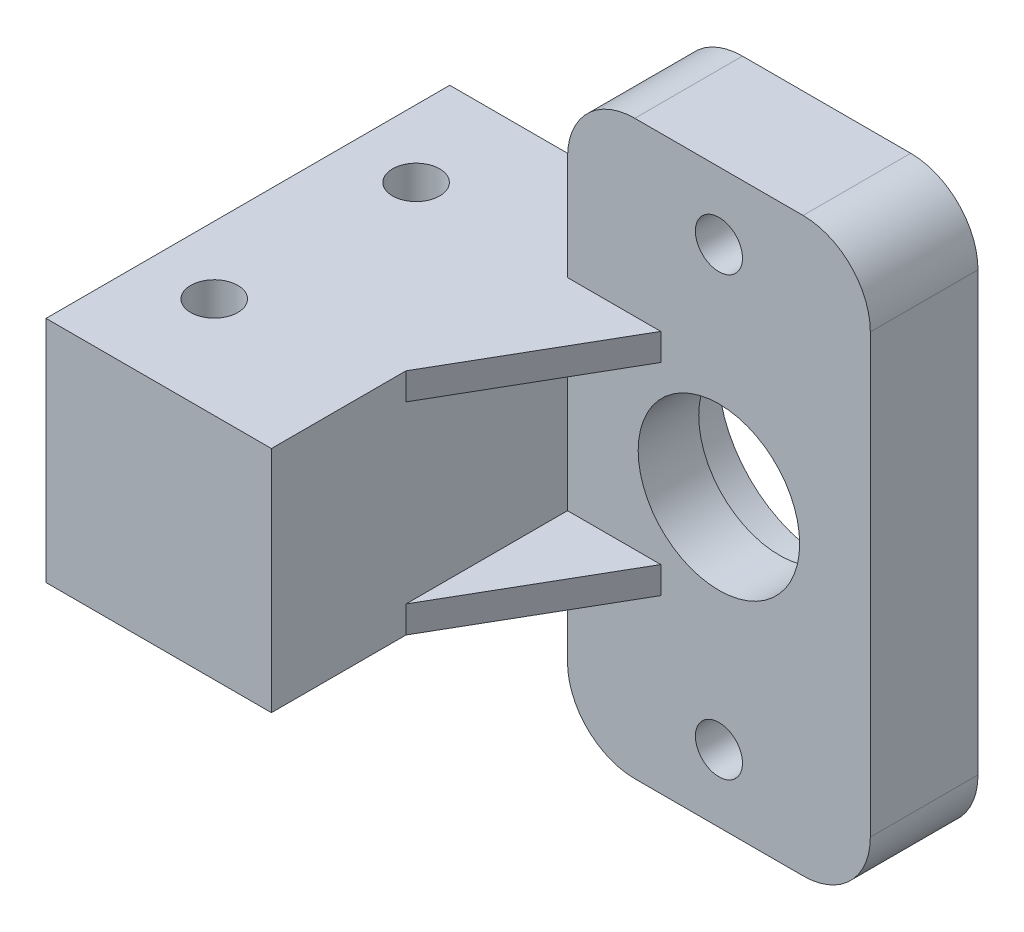
ISO-10303-21;
HEADER;
FILE_DESCRIPTION(('STEP AP214'),'2;1');
FILE_NAME('part.step','',(''),(''),'','','');
FILE_SCHEMA(('AUTOMOTIVE_DESIGN { 1 0 10303 214 1 1 1 1 }'));
ENDSEC;
DATA;
#1=APPLICATION_CONTEXT('core data for automotive mechanical design processes');
#2=APPLICATION_PROTOCOL_DEFINITION('international standard','automotive_design',2000,#1);
#3=PRODUCT_CONTEXT('',#1,'mechanical');
#4=PRODUCT('Part','Part','',(#3));
#5=PRODUCT_RELATED_PRODUCT_CATEGORY('part','',(#4));
#6=PRODUCT_DEFINITION_FORMATION('','',#4);
#7=PRODUCT_DEFINITION_CONTEXT('part definition',#1,'design');
#8=PRODUCT_DEFINITION('design','',#6,#7);
#9=PRODUCT_DEFINITION_SHAPE('','',#8);
#10=(LENGTH_UNIT() NAMED_UNIT(*) SI_UNIT(.MILLI.,.METRE.));
#11=(NAMED_UNIT(*) PLANE_ANGLE_UNIT() SI_UNIT($,.RADIAN.));
#12=(NAMED_UNIT(*) SI_UNIT($,.STERADIAN.) SOLID_ANGLE_UNIT());
#13=UNCERTAINTY_MEASURE_WITH_UNIT(LENGTH_MEASURE(1.E-05),#10,'distance_accuracy_value','');
#14=(GEOMETRIC_REPRESENTATION_CONTEXT(3) GLOBAL_UNCERTAINTY_ASSIGNED_CONTEXT((#13)) GLOBAL_UNIT_ASSIGNED_CONTEXT((#10,
#11,#12)) REPRESENTATION_CONTEXT('',''));
#15=CARTESIAN_POINT('',(0.,0.,0.));
#16=DIRECTION('',(0.,0.,1.));
#17=DIRECTION('',(1.,0.,0.));
#18=AXIS2_PLACEMENT_3D('',#15,#16,#17);
#19=CARTESIAN_POINT('',(-6.25000000000142,16.2500000000003,8.));
#20=DIRECTION('',(0.,0.,1.));
#21=DIRECTION('',(1.,0.,0.));
#22=AXIS2_PLACEMENT_3D('',#19,#20,#21);
#23=PLANE('',#22);
#24=CARTESIAN_POINT('',(0.,16.2500000000003,8.));
#25=DIRECTION('',(0.,0.,1.));
#26=DIRECTION('',(1.,0.,0.));
#27=AXIS2_PLACEMENT_3D('',#24,#25,#26);
#28=CIRCLE('',#27,1.74999999999992);
#29=CARTESIAN_POINT('',(1.74999999999992,16.2500000000003,8.));
#30=VERTEX_POINT('',#29);
#31=EDGE_CURVE('E296',#30,#30,#28,.T.);
#32=ORIENTED_EDGE('',*,*,#31,.F.);
#33=EDGE_LOOP('',(#32));
#34=FACE_BOUND('',#33,.T.);
#35=CARTESIAN_POINT('',(0.,-16.2499999999999,8.));
#36=DIRECTION('',(0.,0.,1.));
#37=DIRECTION('',(1.,0.,0.));
#38=AXIS2_PLACEMENT_3D('',#35,#36,#37);
#39=CIRCLE('',#38,1.74999999999992);
#40=CARTESIAN_POINT('',(1.74999999999992,-16.2499999999999,8.));
#41=VERTEX_POINT('',#40);
#42=EDGE_CURVE('E205',#41,#41,#39,.T.);
#43=ORIENTED_EDGE('',*,*,#42,.F.);
#44=EDGE_LOOP('',(#43));
#45=FACE_BOUND('',#44,.T.);
#46=CARTESIAN_POINT('',(0.,0.,8.));
#47=DIRECTION('',(0.,0.,1.));
#48=DIRECTION('',(1.,0.,0.));
#49=AXIS2_PLACEMENT_3D('',#46,#47,#48);
#50=CIRCLE('',#49,5.99999999999978);
#51=CARTESIAN_POINT('',(5.99999999999978,0.,8.));
#52=VERTEX_POINT('',#51);
#53=EDGE_CURVE('E299',#52,#52,#50,.T.);
#54=ORIENTED_EDGE('',*,*,#53,.F.);
#55=EDGE_LOOP('',(#54));
#56=FACE_BOUND('',#55,.T.);
#57=DIRECTION('',(0.,1.,0.));
#58=VECTOR('',#57,1.);
#59=CARTESIAN_POINT('',(-4.3217967697244,6.50000000000017,8.));
#60=LINE('',#59,#58);
#61=CARTESIAN_POINT('',(-4.3217967697244,6.50000000000017,8.));
#62=VERTEX_POINT('',#61);
#63=CARTESIAN_POINT('',(-4.3217967697244,8.50000000000017,8.));
#64=VERTEX_POINT('',#63);
#65=EDGE_CURVE('E174',#62,#64,#60,.T.);
#66=ORIENTED_EDGE('',*,*,#65,.F.);
#67=DIRECTION('',(-1.,0.,0.));
#68=VECTOR('',#67,1.);
#69=CARTESIAN_POINT('',(-11.2500000000013,6.50000000000017,8.));
#70=LINE('',#69,#68);
#71=CARTESIAN_POINT('',(-11.2500000000013,6.50000000000017,8.));
#72=VERTEX_POINT('',#71);
#73=EDGE_CURVE('E163',#62,#72,#70,.T.);
#74=ORIENTED_EDGE('',*,*,#73,.T.);
#75=DIRECTION('',(0.,-1.,0.));
#76=VECTOR('',#75,1.);
#77=CARTESIAN_POINT('',(-11.2500000000013,16.2500000000003,8.));
#78=LINE('',#77,#76);
#79=CARTESIAN_POINT('',(-11.2500000000013,-6.49999999999973,8.));
#80=VERTEX_POINT('',#79);
#81=EDGE_CURVE('E171',#72,#80,#78,.T.);
#82=ORIENTED_EDGE('',*,*,#81,.T.);
#83=DIRECTION('',(1.,0.,0.));
#84=VECTOR('',#83,1.);
#85=CARTESIAN_POINT('',(-11.2500000000013,-6.49999999999973,8.));
#86=LINE('',#85,#84);
#87=CARTESIAN_POINT('',(-4.3217967697244,-6.49999999999973,8.));
#88=VERTEX_POINT('',#87);
#89=EDGE_CURVE('E52',#80,#88,#86,.T.);
#90=ORIENTED_EDGE('',*,*,#89,.T.);
#91=DIRECTION('',(0.,-1.,0.));
#92=VECTOR('',#91,1.);
#93=CARTESIAN_POINT('',(-4.3217967697244,-6.49999999999973,8.));
#94=LINE('',#93,#92);
#95=CARTESIAN_POINT('',(-4.3217967697244,-8.49999999999973,8.));
#96=VERTEX_POINT('',#95);
#97=EDGE_CURVE('E56',#88,#96,#94,.T.);
#98=ORIENTED_EDGE('',*,*,#97,.T.);
#99=DIRECTION('',(1.,0.,0.));
#100=VECTOR('',#99,1.);
#101=CARTESIAN_POINT('',(-11.2500000000013,-8.49999999999973,8.));
#102=LINE('',#101,#100);
#103=CARTESIAN_POINT('',(-11.2500000000013,-8.49999999999973,8.));
#104=VERTEX_POINT('',#103);
#105=EDGE_CURVE('E387',#104,#96,#102,.T.);
#106=ORIENTED_EDGE('',*,*,#105,.F.);
#107=CARTESIAN_POINT('',(-11.2500000000013,-16.2500000000008,8.));
#108=VERTEX_POINT('',#107);
#109=EDGE_CURVE('E181',#104,#108,#78,.T.);
#110=ORIENTED_EDGE('',*,*,#109,.T.);
#111=CARTESIAN_POINT('',(-6.25000000000142,-16.2500000000008,8.));
#112=DIRECTION('',(0.,0.,1.));
#113=DIRECTION('',(1.,0.,0.));
#114=AXIS2_PLACEMENT_3D('',#111,#112,#113);
#115=CIRCLE('',#114,4.99999999999989);
#116=CARTESIAN_POINT('',(-6.25000000000142,-21.2500000000007,8.));
#117=VERTEX_POINT('',#116);
#118=EDGE_CURVE('E184',#108,#117,#115,.T.);
#119=ORIENTED_EDGE('',*,*,#118,.T.);
#120=DIRECTION('',(1.,0.,0.));
#121=VECTOR('',#120,1.);
#122=CARTESIAN_POINT('',(-6.25000000000142,-21.2500000000007,8.));
#123=LINE('',#122,#121);
#124=CARTESIAN_POINT('',(6.24999999999876,-21.2500000000007,8.));
#125=VERTEX_POINT('',#124);
#126=EDGE_CURVE('E190',#117,#125,#123,.T.);
#127=ORIENTED_EDGE('',*,*,#126,.T.);
#128=CARTESIAN_POINT('',(6.24999999999876,-16.2500000000008,8.));
#129=DIRECTION('',(0.,0.,1.));
#130=DIRECTION('',(1.,0.,0.));
#131=AXIS2_PLACEMENT_3D('',#128,#129,#130);
#132=CIRCLE('',#131,4.99999999999989);
#133=CARTESIAN_POINT('',(11.2499999999986,-16.2500000000008,8.));
#134=VERTEX_POINT('',#133);
#135=EDGE_CURVE('E192',#125,#134,#132,.T.);
#136=ORIENTED_EDGE('',*,*,#135,.T.);
#137=DIRECTION('',(0.,1.,0.));
#138=VECTOR('',#137,1.);
#139=CARTESIAN_POINT('',(11.2499999999986,16.2499999999994,8.));
#140=LINE('',#139,#138);
#141=CARTESIAN_POINT('',(11.2499999999986,16.2499999999994,8.));
#142=VERTEX_POINT('',#141);
#143=EDGE_CURVE('E194',#134,#142,#140,.T.);
#144=ORIENTED_EDGE('',*,*,#143,.T.);
#145=CARTESIAN_POINT('',(6.24999999999876,16.2500000000003,8.));
#146=DIRECTION('',(0.,0.,1.));
#147=DIRECTION('',(1.,0.,0.));
#148=AXIS2_PLACEMENT_3D('',#145,#146,#147);
#149=CIRCLE('',#148,4.99999999999989);
#150=CARTESIAN_POINT('',(6.25000000000009,21.2500000000002,8.));
#151=VERTEX_POINT('',#150);
#152=EDGE_CURVE('E196',#142,#151,#149,.T.);
#153=ORIENTED_EDGE('',*,*,#152,.T.);
#154=DIRECTION('',(-1.,0.,0.));
#155=VECTOR('',#154,1.);
#156=CARTESIAN_POINT('',(-6.25000000000009,21.2500000000002,8.));
#157=LINE('',#156,#155);
#158=CARTESIAN_POINT('',(-6.25000000000009,21.2500000000002,8.));
#159=VERTEX_POINT('',#158);
#160=EDGE_CURVE('E198',#151,#159,#157,.T.);
#161=ORIENTED_EDGE('',*,*,#160,.T.);
#162=CARTESIAN_POINT('',(-6.25000000000142,16.2500000000003,8.));
#163=DIRECTION('',(0.,0.,1.));
#164=DIRECTION('',(1.,0.,0.));
#165=AXIS2_PLACEMENT_3D('',#162,#163,#164);
#166=CIRCLE('',#165,4.99999999999989);
#167=CARTESIAN_POINT('',(-11.2500000000013,16.2500000000003,8.));
#168=VERTEX_POINT('',#167);
#169=EDGE_CURVE('E185',#159,#168,#166,.T.);
#170=ORIENTED_EDGE('',*,*,#169,.T.);
#171=CARTESIAN_POINT('',(-11.2500000000013,8.50000000000017,8.));
#172=VERTEX_POINT('',#171);
#173=EDGE_CURVE('E180',#168,#172,#78,.T.);
#174=ORIENTED_EDGE('',*,*,#173,.T.);
#175=DIRECTION('',(-1.,0.,0.));
#176=VECTOR('',#175,1.);
#177=CARTESIAN_POINT('',(-11.2500000000013,8.50000000000017,8.));
#178=LINE('',#177,#176);
#179=EDGE_CURVE('E410',#64,#172,#178,.T.);
#180=ORIENTED_EDGE('',*,*,#179,.F.);
#181=EDGE_LOOP('',(#66,#74,#82,#90,#98,#106,#110,#119,#127,#136,#144,#153,#161,#170,#174,#180));
#182=FACE_BOUND('',#181,.T.);
#183=ADVANCED_FACE('F35',(#34,#45,#56,#182),#23,.T.);
#184=CARTESIAN_POINT('',(-11.2500000000013,16.2500000000003,8.));
#185=DIRECTION('',(1.,0.,0.));
#186=DIRECTION('',(0.,0.,-1.));
#187=AXIS2_PLACEMENT_3D('',#184,#185,#186);
#188=PLANE('',#187);
#189=DIRECTION('',(0.,0.,1.));
#190=VECTOR('',#189,1.);
#191=CARTESIAN_POINT('',(-11.2500000000013,-8.49999999999973,8.));
#192=LINE('',#191,#190);
#193=CARTESIAN_POINT('',(-11.25,-8.49999999999973,0.));
#194=VERTEX_POINT('',#193);
#195=EDGE_CURVE('E11',#194,#104,#192,.T.);
#196=ORIENTED_EDGE('',*,*,#195,.F.);
#197=DIRECTION('',(0.,-1.,0.));
#198=VECTOR('',#197,1.);
#199=CARTESIAN_POINT('',(-11.2500000000013,16.2500000000003,0.));
#200=LINE('',#199,#198);
#201=CARTESIAN_POINT('',(-11.2500000000013,-16.2500000000008,0.));
#202=VERTEX_POINT('',#201);
#203=EDGE_CURVE('E204',#194,#202,#200,.T.);
#204=ORIENTED_EDGE('',*,*,#203,.T.);
#205=DIRECTION('',(0.,0.,-1.));
#206=VECTOR('',#205,1.);
#207=CARTESIAN_POINT('',(-11.2500000000013,-16.2500000000008,8.));
#208=LINE('',#207,#206);
#209=EDGE_CURVE('E237',#108,#202,#208,.T.);
#210=ORIENTED_EDGE('',*,*,#209,.F.);
#211=ORIENTED_EDGE('',*,*,#109,.F.);
#212=EDGE_LOOP('',(#196,#204,#210,#211));
#213=FACE_BOUND('',#212,.T.);
#214=ADVANCED_FACE('F331',(#213),#188,.F.);
#215=DIRECTION('',(0.,0.,-1.));
#216=VECTOR('',#215,1.);
#217=CARTESIAN_POINT('',(-11.2500000000013,8.50000000000017,8.));
#218=LINE('',#217,#216);
#219=CARTESIAN_POINT('',(-11.2500000000013,8.50000000000017,0.));
#220=VERTEX_POINT('',#219);
#221=EDGE_CURVE('E44',#172,#220,#218,.T.);
#222=ORIENTED_EDGE('',*,*,#221,.F.);
#223=ORIENTED_EDGE('',*,*,#173,.F.);
#224=DIRECTION('',(0.,0.,-1.));
#225=VECTOR('',#224,1.);
#226=CARTESIAN_POINT('',(-11.2500000000013,16.2500000000003,8.));
#227=LINE('',#226,#225);
#228=CARTESIAN_POINT('',(-11.2500000000013,16.2500000000003,0.));
#229=VERTEX_POINT('',#228);
#230=EDGE_CURVE('E240',#168,#229,#227,.T.);
#231=ORIENTED_EDGE('',*,*,#230,.T.);
#232=EDGE_CURVE('E206',#229,#220,#200,.T.);
#233=ORIENTED_EDGE('',*,*,#232,.T.);
#234=EDGE_LOOP('',(#222,#223,#231,#233));
#235=FACE_BOUND('',#234,.T.);
#236=ADVANCED_FACE('F336',(#235),#188,.F.);
#237=CARTESIAN_POINT('',(0.,0.,8.));
#238=DIRECTION('',(0.,0.,-1.));
#239=DIRECTION('',(-1.,0.,0.));
#240=AXIS2_PLACEMENT_3D('',#237,#238,#239);
#241=CYLINDRICAL_SURFACE('',#240,5.99999999999978);
#242=ORIENTED_EDGE('',*,*,#53,.T.);
#243=EDGE_LOOP('',(#242));
#244=FACE_BOUND('',#243,.T.);
#245=CARTESIAN_POINT('',(0.,0.,3.5));
#246=DIRECTION('',(0.,0.,-1.));
#247=DIRECTION('',(-1.,0.,0.));
#248=AXIS2_PLACEMENT_3D('',#245,#246,#247);
#249=CIRCLE('',#248,5.99999999999978);
#250=CARTESIAN_POINT('',(-5.99999999999978,0.,3.5));
#251=VERTEX_POINT('',#250);
#252=EDGE_CURVE('E243',#251,#251,#249,.T.);
#253=ORIENTED_EDGE('',*,*,#252,.T.);
#254=EDGE_LOOP('',(#253));
#255=FACE_BOUND('',#254,.T.);
#256=ADVANCED_FACE('F342',(#244,#255),#241,.F.);
#257=CARTESIAN_POINT('',(-6.25000000000142,16.2500000000003,0.));
#258=DIRECTION('',(0.,0.,1.));
#259=DIRECTION('',(1.,0.,0.));
#260=AXIS2_PLACEMENT_3D('',#257,#258,#259);
#261=PLANE('',#260);
#262=CARTESIAN_POINT('',(0.,0.,0.));
#263=DIRECTION('',(0.,0.,-1.));
#264=DIRECTION('',(-1.,0.,0.));
#265=AXIS2_PLACEMENT_3D('',#262,#263,#264);
#266=CIRCLE('',#265,8.05000000000033);
#267=CARTESIAN_POINT('',(-8.05000000000033,0.,0.));
#268=VERTEX_POINT('',#267);
#269=EDGE_CURVE('E291',#268,#268,#266,.T.);
#270=ORIENTED_EDGE('',*,*,#269,.F.);
#271=EDGE_LOOP('',(#270));
#272=FACE_BOUND('',#271,.T.);
#273=CARTESIAN_POINT('',(-6.25000000000142,16.2500000000003,0.));
#274=DIRECTION('',(0.,0.,1.));
#275=DIRECTION('',(1.,0.,0.));
#276=AXIS2_PLACEMENT_3D('',#273,#274,#275);
#277=CIRCLE('',#276,4.99999999999989);
#278=CARTESIAN_POINT('',(-6.25000000000009,21.2500000000002,0.));
#279=VERTEX_POINT('',#278);
#280=EDGE_CURVE('E201',#279,#229,#277,.T.);
#281=ORIENTED_EDGE('',*,*,#280,.F.);
#282=DIRECTION('',(-1.,0.,0.));
#283=VECTOR('',#282,1.);
#284=CARTESIAN_POINT('',(-6.25000000000009,21.2500000000002,0.));
#285=LINE('',#284,#283);
#286=CARTESIAN_POINT('',(6.25000000000009,21.2500000000002,0.));
#287=VERTEX_POINT('',#286);
#288=EDGE_CURVE('E218',#287,#279,#285,.T.);
#289=ORIENTED_EDGE('',*,*,#288,.F.);
#290=CARTESIAN_POINT('',(6.24999999999876,16.2500000000003,0.));
#291=DIRECTION('',(0.,0.,1.));
#292=DIRECTION('',(1.,0.,0.));
#293=AXIS2_PLACEMENT_3D('',#290,#291,#292);
#294=CIRCLE('',#293,4.99999999999989);
#295=CARTESIAN_POINT('',(11.2499999999986,16.2499999999994,0.));
#296=VERTEX_POINT('',#295);
#297=EDGE_CURVE('E216',#296,#287,#294,.T.);
#298=ORIENTED_EDGE('',*,*,#297,.F.);
#299=DIRECTION('',(0.,1.,0.));
#300=VECTOR('',#299,1.);
#301=CARTESIAN_POINT('',(11.2499999999986,16.2499999999994,0.));
#302=LINE('',#301,#300);
#303=CARTESIAN_POINT('',(11.2499999999986,-16.2500000000008,0.));
#304=VERTEX_POINT('',#303);
#305=EDGE_CURVE('E214',#304,#296,#302,.T.);
#306=ORIENTED_EDGE('',*,*,#305,.F.);
#307=CARTESIAN_POINT('',(6.24999999999876,-16.2500000000008,0.));
#308=DIRECTION('',(0.,0.,1.));
#309=DIRECTION('',(1.,0.,0.));
#310=AXIS2_PLACEMENT_3D('',#307,#308,#309);
#311=CIRCLE('',#310,4.99999999999989);
#312=CARTESIAN_POINT('',(6.24999999999876,-21.2500000000007,0.));
#313=VERTEX_POINT('',#312);
#314=EDGE_CURVE('E212',#313,#304,#311,.T.);
#315=ORIENTED_EDGE('',*,*,#314,.F.);
#316=DIRECTION('',(1.,0.,0.));
#317=VECTOR('',#316,1.);
#318=CARTESIAN_POINT('',(-6.25000000000142,-21.2500000000007,0.));
#319=LINE('',#318,#317);
#320=CARTESIAN_POINT('',(-6.25000000000142,-21.2500000000007,0.));
#321=VERTEX_POINT('',#320);
#322=EDGE_CURVE('E210',#321,#313,#319,.T.);
#323=ORIENTED_EDGE('',*,*,#322,.F.);
#324=CARTESIAN_POINT('',(-6.25000000000142,-16.2500000000008,0.));
#325=DIRECTION('',(0.,0.,1.));
#326=DIRECTION('',(1.,0.,0.));
#327=AXIS2_PLACEMENT_3D('',#324,#325,#326);
#328=CIRCLE('',#327,4.99999999999989);
#329=EDGE_CURVE('E208',#202,#321,#328,.T.);
#330=ORIENTED_EDGE('',*,*,#329,.F.);
#331=ORIENTED_EDGE('',*,*,#203,.F.);
#332=DIRECTION('',(1.,0.,0.));
#333=VECTOR('',#332,1.);
#334=CARTESIAN_POINT('',(-28.0000000000005,-8.49999999999973,0.));
#335=LINE('',#334,#333);
#336=CARTESIAN_POINT('',(-28.0000000000005,-8.49999999999973,0.));
#337=VERTEX_POINT('',#336);
#338=EDGE_CURVE('E256',#337,#194,#335,.T.);
#339=ORIENTED_EDGE('',*,*,#338,.F.);
#340=DIRECTION('',(0.,-1.,0.));
#341=VECTOR('',#340,1.);
#342=CARTESIAN_POINT('',(-28.0000000000005,8.50000000000017,0.));
#343=LINE('',#342,#341);
#344=CARTESIAN_POINT('',(-28.0000000000005,8.50000000000017,0.));
#345=VERTEX_POINT('',#344);
#346=EDGE_CURVE('E251',#345,#337,#343,.T.);
#347=ORIENTED_EDGE('',*,*,#346,.F.);
#348=DIRECTION('',(-1.,0.,0.));
#349=VECTOR('',#348,1.);
#350=CARTESIAN_POINT('',(-28.0000000000005,8.50000000000017,0.));
#351=LINE('',#350,#349);
#352=EDGE_CURVE('E271',#220,#345,#351,.T.);
#353=ORIENTED_EDGE('',*,*,#352,.F.);
#354=ORIENTED_EDGE('',*,*,#232,.F.);
#355=EDGE_LOOP('',(#281,#289,#298,#306,#315,#323,#330,#331,#339,#347,#353,#354));
#356=FACE_BOUND('',#355,.T.);
#357=CARTESIAN_POINT('',(0.,-16.2499999999999,0.));
#358=DIRECTION('',(0.,0.,1.));
#359=DIRECTION('',(1.,0.,0.));
#360=AXIS2_PLACEMENT_3D('',#357,#358,#359);
#361=CIRCLE('',#360,1.74999999999992);
#362=CARTESIAN_POINT('',(1.74999999999992,-16.2499999999999,0.));
#363=VERTEX_POINT('',#362);
#364=EDGE_CURVE('E304',#363,#363,#361,.T.);
#365=ORIENTED_EDGE('',*,*,#364,.T.);
#366=EDGE_LOOP('',(#365));
#367=FACE_BOUND('',#366,.T.);
#368=CARTESIAN_POINT('',(0.,16.2500000000003,0.));
#369=DIRECTION('',(0.,0.,1.));
#370=DIRECTION('',(1.,0.,0.));
#371=AXIS2_PLACEMENT_3D('',#368,#369,#370);
#372=CIRCLE('',#371,1.74999999999992);
#373=CARTESIAN_POINT('',(1.74999999999992,16.2500000000003,0.));
#374=VERTEX_POINT('',#373);
#375=EDGE_CURVE('E246',#374,#374,#372,.T.);
#376=ORIENTED_EDGE('',*,*,#375,.T.);
#377=EDGE_LOOP('',(#376));
#378=FACE_BOUND('',#377,.T.);
#379=ADVANCED_FACE('F309',(#272,#356,#367,#378),#261,.F.);
#380=CARTESIAN_POINT('',(-6.25000000000142,16.2500000000003,8.));
#381=DIRECTION('',(0.,0.,-1.));
#382=DIRECTION('',(-1.,0.,0.));
#383=AXIS2_PLACEMENT_3D('',#380,#381,#382);
#384=CYLINDRICAL_SURFACE('',#383,4.99999999999989);
#385=ORIENTED_EDGE('',*,*,#280,.T.);
#386=ORIENTED_EDGE('',*,*,#230,.F.);
#387=ORIENTED_EDGE('',*,*,#169,.F.);
#388=DIRECTION('',(0.,0.,-1.));
#389=VECTOR('',#388,1.);
#390=CARTESIAN_POINT('',(-6.25000000000009,21.2500000000002,8.));
#391=LINE('',#390,#389);
#392=EDGE_CURVE('E200',#159,#279,#391,.T.);
#393=ORIENTED_EDGE('',*,*,#392,.T.);
#394=EDGE_LOOP('',(#385,#386,#387,#393));
#395=FACE_BOUND('',#394,.T.);
#396=ADVANCED_FACE('F37',(#395),#384,.T.);
#397=CARTESIAN_POINT('',(-6.25000000000142,-16.2500000000008,8.));
#398=DIRECTION('',(0.,0.,-1.));
#399=DIRECTION('',(-1.,0.,0.));
#400=AXIS2_PLACEMENT_3D('',#397,#398,#399);
#401=CYLINDRICAL_SURFACE('',#400,4.99999999999989);
#402=ORIENTED_EDGE('',*,*,#329,.T.);
#403=DIRECTION('',(0.,0.,-1.));
#404=VECTOR('',#403,1.);
#405=CARTESIAN_POINT('',(-6.25000000000142,-21.2500000000007,8.));
#406=LINE('',#405,#404);
#407=EDGE_CURVE('E234',#117,#321,#406,.T.);
#408=ORIENTED_EDGE('',*,*,#407,.F.);
#409=ORIENTED_EDGE('',*,*,#118,.F.);
#410=ORIENTED_EDGE('',*,*,#209,.T.);
#411=EDGE_LOOP('',(#402,#408,#409,#410));
#412=FACE_BOUND('',#411,.T.);
#413=ADVANCED_FACE('F359',(#412),#401,.T.);
#414=CARTESIAN_POINT('',(-6.25000000000142,-21.2500000000007,8.));
#415=DIRECTION('',(0.,1.,0.));
#416=DIRECTION('',(0.,0.,1.));
#417=AXIS2_PLACEMENT_3D('',#414,#415,#416);
#418=PLANE('',#417);
#419=ORIENTED_EDGE('',*,*,#322,.T.);
#420=DIRECTION('',(0.,0.,-1.));
#421=VECTOR('',#420,1.);
#422=CARTESIAN_POINT('',(6.24999999999876,-21.2500000000007,8.));
#423=LINE('',#422,#421);
#424=EDGE_CURVE('E231',#125,#313,#423,.T.);
#425=ORIENTED_EDGE('',*,*,#424,.F.);
#426=ORIENTED_EDGE('',*,*,#126,.F.);
#427=ORIENTED_EDGE('',*,*,#407,.T.);
#428=EDGE_LOOP('',(#419,#425,#426,#427));
#429=FACE_BOUND('',#428,.T.);
#430=ADVANCED_FACE('F355',(#429),#418,.F.);
#431=CARTESIAN_POINT('',(6.24999999999876,-16.2500000000008,8.));
#432=DIRECTION('',(0.,0.,-1.));
#433=DIRECTION('',(-1.,0.,0.));
#434=AXIS2_PLACEMENT_3D('',#431,#432,#433);
#435=CYLINDRICAL_SURFACE('',#434,4.99999999999989);
#436=ORIENTED_EDGE('',*,*,#314,.T.);
#437=DIRECTION('',(0.,0.,-1.));
#438=VECTOR('',#437,1.);
#439=CARTESIAN_POINT('',(11.2499999999986,-16.2500000000008,8.));
#440=LINE('',#439,#438);
#441=EDGE_CURVE('E228',#134,#304,#440,.T.);
#442=ORIENTED_EDGE('',*,*,#441,.F.);
#443=ORIENTED_EDGE('',*,*,#135,.F.);
#444=ORIENTED_EDGE('',*,*,#424,.T.);
#445=EDGE_LOOP('',(#436,#442,#443,#444));
#446=FACE_BOUND('',#445,.T.);
#447=ADVANCED_FACE('F351',(#446),#435,.T.);
#448=CARTESIAN_POINT('',(11.2499999999986,16.2499999999994,8.));
#449=DIRECTION('',(-1.,0.,0.));
#450=DIRECTION('',(0.,0.,1.));
#451=AXIS2_PLACEMENT_3D('',#448,#449,#450);
#452=PLANE('',#451);
#453=ORIENTED_EDGE('',*,*,#305,.T.);
#454=DIRECTION('',(0.,0.,-1.));
#455=VECTOR('',#454,1.);
#456=CARTESIAN_POINT('',(11.2499999999986,16.2499999999994,8.));
#457=LINE('',#456,#455);
#458=EDGE_CURVE('E225',#142,#296,#457,.T.);
#459=ORIENTED_EDGE('',*,*,#458,.F.);
#460=ORIENTED_EDGE('',*,*,#143,.F.);
#461=ORIENTED_EDGE('',*,*,#441,.T.);
#462=EDGE_LOOP('',(#453,#459,#460,#461));
#463=FACE_BOUND('',#462,.T.);
#464=ADVANCED_FACE('F347',(#463),#452,.F.);
#465=CARTESIAN_POINT('',(6.24999999999876,16.2500000000003,8.));
#466=DIRECTION('',(0.,0.,-1.));
#467=DIRECTION('',(-1.,0.,0.));
#468=AXIS2_PLACEMENT_3D('',#465,#466,#467);
#469=CYLINDRICAL_SURFACE('',#468,4.99999999999989);
#470=ORIENTED_EDGE('',*,*,#297,.T.);
#471=DIRECTION('',(0.,0.,-1.));
#472=VECTOR('',#471,1.);
#473=CARTESIAN_POINT('',(6.25000000000009,21.2500000000002,8.));
#474=LINE('',#473,#472);
#475=EDGE_CURVE('E222',#151,#287,#474,.T.);
#476=ORIENTED_EDGE('',*,*,#475,.F.);
#477=ORIENTED_EDGE('',*,*,#152,.F.);
#478=ORIENTED_EDGE('',*,*,#458,.T.);
#479=EDGE_LOOP('',(#470,#476,#477,#478));
#480=FACE_BOUND('',#479,.T.);
#481=ADVANCED_FACE('F325',(#480),#469,.T.);
#482=CARTESIAN_POINT('',(-6.25000000000009,21.2500000000002,8.));
#483=DIRECTION('',(0.,-1.,0.));
#484=DIRECTION('',(0.,0.,-1.));
#485=AXIS2_PLACEMENT_3D('',#482,#483,#484);
#486=PLANE('',#485);
#487=ORIENTED_EDGE('',*,*,#288,.T.);
#488=ORIENTED_EDGE('',*,*,#392,.F.);
#489=ORIENTED_EDGE('',*,*,#160,.F.);
#490=ORIENTED_EDGE('',*,*,#475,.T.);
#491=EDGE_LOOP('',(#487,#488,#489,#490));
#492=FACE_BOUND('',#491,.T.);
#493=ADVANCED_FACE('F315',(#492),#486,.F.);
#494=CARTESIAN_POINT('',(0.,-16.2499999999999,8.));
#495=DIRECTION('',(0.,0.,-1.));
#496=DIRECTION('',(-1.,0.,0.));
#497=AXIS2_PLACEMENT_3D('',#494,#495,#496);
#498=CYLINDRICAL_SURFACE('',#497,1.74999999999992);
#499=ORIENTED_EDGE('',*,*,#42,.T.);
#500=EDGE_LOOP('',(#499));
#501=FACE_BOUND('',#500,.T.);
#502=ORIENTED_EDGE('',*,*,#364,.F.);
#503=EDGE_LOOP('',(#502));
#504=FACE_BOUND('',#503,.T.);
#505=ADVANCED_FACE('F312',(#501,#504),#498,.F.);
#506=CARTESIAN_POINT('',(0.,16.2500000000003,8.));
#507=DIRECTION('',(0.,0.,-1.));
#508=DIRECTION('',(-1.,0.,0.));
#509=AXIS2_PLACEMENT_3D('',#506,#507,#508);
#510=CYLINDRICAL_SURFACE('',#509,1.74999999999992);
#511=ORIENTED_EDGE('',*,*,#31,.T.);
#512=EDGE_LOOP('',(#511));
#513=FACE_BOUND('',#512,.T.);
#514=ORIENTED_EDGE('',*,*,#375,.F.);
#515=EDGE_LOOP('',(#514));
#516=FACE_BOUND('',#515,.T.);
#517=ADVANCED_FACE('F314',(#513,#516),#510,.F.);
#518=CARTESIAN_POINT('',(0.,0.,3.5));
#519=DIRECTION('',(0.,0.,-1.));
#520=DIRECTION('',(-1.,0.,0.));
#521=AXIS2_PLACEMENT_3D('',#518,#519,#520);
#522=CYLINDRICAL_SURFACE('',#521,8.05000000000033);
#523=CARTESIAN_POINT('',(0.,0.,3.5));
#524=DIRECTION('',(0.,0.,-1.));
#525=DIRECTION('',(-1.,0.,0.));
#526=AXIS2_PLACEMENT_3D('',#523,#524,#525);
#527=CIRCLE('',#526,8.05000000000033);
#528=CARTESIAN_POINT('',(-8.05000000000033,0.,3.5));
#529=VERTEX_POINT('',#528);
#530=EDGE_CURVE('E247',#529,#529,#527,.T.);
#531=ORIENTED_EDGE('',*,*,#530,.F.);
#532=EDGE_LOOP('',(#531));
#533=FACE_BOUND('',#532,.T.);
#534=ORIENTED_EDGE('',*,*,#269,.T.);
#535=EDGE_LOOP('',(#534));
#536=FACE_BOUND('',#535,.T.);
#537=ADVANCED_FACE('F322',(#533,#536),#522,.F.);
#538=CARTESIAN_POINT('',(0.,0.,3.5));
#539=DIRECTION('',(0.,0.,-1.));
#540=DIRECTION('',(-1.,0.,0.));
#541=AXIS2_PLACEMENT_3D('',#538,#539,#540);
#542=PLANE('',#541);
#543=ORIENTED_EDGE('',*,*,#252,.F.);
#544=EDGE_LOOP('',(#543));
#545=FACE_BOUND('',#544,.T.);
#546=ORIENTED_EDGE('',*,*,#530,.T.);
#547=EDGE_LOOP('',(#546));
#548=FACE_BOUND('',#547,.T.);
#549=ADVANCED_FACE('F457',(#545,#548),#542,.T.);
#550=CARTESIAN_POINT('',(-28.0000000000005,8.50000000000017,30.));
#551=DIRECTION('',(1.,0.,0.));
#552=DIRECTION('',(0.,0.,-1.));
#553=AXIS2_PLACEMENT_3D('',#550,#551,#552);
#554=PLANE('',#553);
#555=ORIENTED_EDGE('',*,*,#346,.T.);
#556=DIRECTION('',(0.,0.,-1.));
#557=VECTOR('',#556,1.);
#558=CARTESIAN_POINT('',(-28.0000000000005,-8.49999999999973,30.));
#559=LINE('',#558,#557);
#560=CARTESIAN_POINT('',(-28.0000000000005,-8.49999999999973,30.));
#561=VERTEX_POINT('',#560);
#562=EDGE_CURVE('E288',#561,#337,#559,.T.);
#563=ORIENTED_EDGE('',*,*,#562,.F.);
#564=DIRECTION('',(0.,-1.,0.));
#565=VECTOR('',#564,1.);
#566=CARTESIAN_POINT('',(-28.0000000000005,8.50000000000017,30.));
#567=LINE('',#566,#565);
#568=CARTESIAN_POINT('',(-28.0000000000005,8.50000000000017,30.));
#569=VERTEX_POINT('',#568);
#570=EDGE_CURVE('E267',#569,#561,#567,.T.);
#571=ORIENTED_EDGE('',*,*,#570,.F.);
#572=DIRECTION('',(0.,0.,-1.));
#573=VECTOR('',#572,1.);
#574=CARTESIAN_POINT('',(-28.0000000000005,8.50000000000017,30.));
#575=LINE('',#574,#573);
#576=EDGE_CURVE('E276',#569,#345,#575,.T.);
#577=ORIENTED_EDGE('',*,*,#576,.T.);
#578=EDGE_LOOP('',(#555,#563,#571,#577));
#579=FACE_BOUND('',#578,.T.);
#580=ADVANCED_FACE('F397',(#579),#554,.F.);
#581=CARTESIAN_POINT('',(-28.0000000000005,-8.49999999999973,30.));
#582=DIRECTION('',(0.,1.,0.));
#583=DIRECTION('',(0.,0.,1.));
#584=AXIS2_PLACEMENT_3D('',#581,#582,#583);
#585=PLANE('',#584);
#586=CARTESIAN_POINT('',(-23.0000000000005,-8.49999999999973,7.5));
#587=DIRECTION('',(0.,-1.,0.));
#588=DIRECTION('',(0.,0.,-1.));
#589=AXIS2_PLACEMENT_3D('',#586,#587,#588);
#590=CIRCLE('',#589,1.75);
#591=CARTESIAN_POINT('',(-23.0000000000005,-8.49999999999973,5.75));
#592=VERTEX_POINT('',#591);
#593=EDGE_CURVE('E263',#592,#592,#590,.T.);
#594=ORIENTED_EDGE('',*,*,#593,.F.);
#595=EDGE_LOOP('',(#594));
#596=FACE_BOUND('',#595,.T.);
#597=CARTESIAN_POINT('',(-23.0000000000005,-8.49999999999973,22.5));
#598=DIRECTION('',(0.,-1.,0.));
#599=DIRECTION('',(0.,0.,-1.));
#600=AXIS2_PLACEMENT_3D('',#597,#598,#599);
#601=CIRCLE('',#600,1.75);
#602=CARTESIAN_POINT('',(-23.0000000000005,-8.49999999999973,20.75));
#603=VERTEX_POINT('',#602);
#604=EDGE_CURVE('E252',#603,#603,#601,.T.);
#605=ORIENTED_EDGE('',*,*,#604,.F.);
#606=EDGE_LOOP('',(#605));
#607=FACE_BOUND('',#606,.T.);
#608=ORIENTED_EDGE('',*,*,#338,.T.);
#609=ORIENTED_EDGE('',*,*,#195,.T.);
#610=ORIENTED_EDGE('',*,*,#105,.T.);
#611=DIRECTION('',(-0.500000000000004,0.,0.866025403784436));
#612=VECTOR('',#611,1.);
#613=CARTESIAN_POINT('',(-4.3217967697244,-8.49999999999973,8.));
#614=LINE('',#613,#612);
#615=CARTESIAN_POINT('',(-11.25,-8.49999999999973,20.));
#616=VERTEX_POINT('',#615);
#617=EDGE_CURVE('E417',#96,#616,#614,.T.);
#618=ORIENTED_EDGE('',*,*,#617,.T.);
#619=DIRECTION('',(0.,0.,-1.));
#620=VECTOR('',#619,1.);
#621=CARTESIAN_POINT('',(-11.25,-8.49999999999973,30.));
#622=LINE('',#621,#620);
#623=CARTESIAN_POINT('',(-11.25,-8.49999999999973,30.));
#624=VERTEX_POINT('',#623);
#625=EDGE_CURVE('E286',#624,#616,#622,.T.);
#626=ORIENTED_EDGE('',*,*,#625,.F.);
#627=DIRECTION('',(1.,0.,0.));
#628=VECTOR('',#627,1.);
#629=CARTESIAN_POINT('',(-28.0000000000005,-8.49999999999973,30.));
#630=LINE('',#629,#628);
#631=EDGE_CURVE('E270',#561,#624,#630,.T.);
#632=ORIENTED_EDGE('',*,*,#631,.F.);
#633=ORIENTED_EDGE('',*,*,#562,.T.);
#634=EDGE_LOOP('',(#608,#609,#610,#618,#626,#632,#633));
#635=FACE_BOUND('',#634,.T.);
#636=ADVANCED_FACE('F393',(#596,#607,#635),#585,.F.);
#637=CARTESIAN_POINT('',(-11.25,8.50000000000017,30.));
#638=DIRECTION('',(-1.,0.,0.));
#639=DIRECTION('',(0.,0.,1.));
#640=AXIS2_PLACEMENT_3D('',#637,#638,#639);
#641=PLANE('',#640);
#642=DIRECTION('',(1.11022302462516E-13,0.,1.));
#643=VECTOR('',#642,1.);
#644=CARTESIAN_POINT('',(-11.25,6.50000000000017,20.));
#645=LINE('',#644,#643);
#646=CARTESIAN_POINT('',(-11.25,6.50000000000017,20.));
#647=VERTEX_POINT('',#646);
#648=EDGE_CURVE('E160',#72,#647,#645,.T.);
#649=ORIENTED_EDGE('',*,*,#648,.T.);
#650=DIRECTION('',(0.,1.,0.));
#651=VECTOR('',#650,1.);
#652=CARTESIAN_POINT('',(-11.25,6.50000000000017,20.));
#653=LINE('',#652,#651);
#654=CARTESIAN_POINT('',(-11.25,8.50000000000017,20.));
#655=VERTEX_POINT('',#654);
#656=EDGE_CURVE('E418',#647,#655,#653,.T.);
#657=ORIENTED_EDGE('',*,*,#656,.T.);
#658=DIRECTION('',(0.,0.,-1.));
#659=VECTOR('',#658,1.);
#660=CARTESIAN_POINT('',(-11.25,8.50000000000017,30.));
#661=LINE('',#660,#659);
#662=CARTESIAN_POINT('',(-11.25,8.50000000000017,30.));
#663=VERTEX_POINT('',#662);
#664=EDGE_CURVE('E283',#663,#655,#661,.T.);
#665=ORIENTED_EDGE('',*,*,#664,.F.);
#666=DIRECTION('',(0.,1.,0.));
#667=VECTOR('',#666,1.);
#668=CARTESIAN_POINT('',(-11.25,8.50000000000017,30.));
#669=LINE('',#668,#667);
#670=EDGE_CURVE('E273',#624,#663,#669,.T.);
#671=ORIENTED_EDGE('',*,*,#670,.F.);
#672=ORIENTED_EDGE('',*,*,#625,.T.);
#673=DIRECTION('',(0.,-1.,0.));
#674=VECTOR('',#673,1.);
#675=CARTESIAN_POINT('',(-11.25,-6.49999999999973,20.));
#676=LINE('',#675,#674);
#677=CARTESIAN_POINT('',(-11.25,-6.49999999999973,20.));
#678=VERTEX_POINT('',#677);
#679=EDGE_CURVE('E425',#678,#616,#676,.T.);
#680=ORIENTED_EDGE('',*,*,#679,.F.);
#681=DIRECTION('',(-1.11022302462516E-13,0.,-1.));
#682=VECTOR('',#681,1.);
#683=CARTESIAN_POINT('',(-11.25,-6.49999999999973,20.));
#684=LINE('',#683,#682);
#685=EDGE_CURVE('E179',#678,#80,#684,.T.);
#686=ORIENTED_EDGE('',*,*,#685,.T.);
#687=ORIENTED_EDGE('',*,*,#81,.F.);
#688=EDGE_LOOP('',(#649,#657,#665,#671,#672,#680,#686,#687));
#689=FACE_BOUND('',#688,.T.);
#690=ADVANCED_FACE('F177',(#689),#641,.F.);
#691=CARTESIAN_POINT('',(-28.0000000000005,8.50000000000017,30.));
#692=DIRECTION('',(0.,-1.,0.));
#693=DIRECTION('',(0.,0.,-1.));
#694=AXIS2_PLACEMENT_3D('',#691,#692,#693);
#695=PLANE('',#694);
#696=CARTESIAN_POINT('',(-23.0000000000005,8.50000000000017,7.5));
#697=DIRECTION('',(0.,-1.,0.));
#698=DIRECTION('',(0.,0.,-1.));
#699=AXIS2_PLACEMENT_3D('',#696,#697,#698);
#700=CIRCLE('',#699,1.75);
#701=CARTESIAN_POINT('',(-23.0000000000005,8.50000000000017,5.75));
#702=VERTEX_POINT('',#701);
#703=EDGE_CURVE('E39',#702,#702,#700,.T.);
#704=ORIENTED_EDGE('',*,*,#703,.T.);
#705=EDGE_LOOP('',(#704));
#706=FACE_BOUND('',#705,.T.);
#707=CARTESIAN_POINT('',(-23.0000000000005,8.50000000000017,22.5));
#708=DIRECTION('',(0.,-1.,0.));
#709=DIRECTION('',(0.,0.,-1.));
#710=AXIS2_PLACEMENT_3D('',#707,#708,#709);
#711=CIRCLE('',#710,1.75);
#712=CARTESIAN_POINT('',(-23.0000000000005,8.50000000000017,20.75));
#713=VERTEX_POINT('',#712);
#714=EDGE_CURVE('E249',#713,#713,#711,.T.);
#715=ORIENTED_EDGE('',*,*,#714,.T.);
#716=EDGE_LOOP('',(#715));
#717=FACE_BOUND('',#716,.T.);
#718=ORIENTED_EDGE('',*,*,#352,.T.);
#719=ORIENTED_EDGE('',*,*,#576,.F.);
#720=DIRECTION('',(-1.,0.,0.));
#721=VECTOR('',#720,1.);
#722=CARTESIAN_POINT('',(-28.0000000000005,8.50000000000017,30.));
#723=LINE('',#722,#721);
#724=EDGE_CURVE('E275',#663,#569,#723,.T.);
#725=ORIENTED_EDGE('',*,*,#724,.F.);
#726=ORIENTED_EDGE('',*,*,#664,.T.);
#727=DIRECTION('',(0.500000000000004,0.,-0.866025403784436));
#728=VECTOR('',#727,1.);
#729=CARTESIAN_POINT('',(-4.3217967697244,8.50000000000017,8.));
#730=LINE('',#729,#728);
#731=EDGE_CURVE('E175',#655,#64,#730,.T.);
#732=ORIENTED_EDGE('',*,*,#731,.T.);
#733=ORIENTED_EDGE('',*,*,#179,.T.);
#734=ORIENTED_EDGE('',*,*,#221,.T.);
#735=EDGE_LOOP('',(#718,#719,#725,#726,#732,#733,#734));
#736=FACE_BOUND('',#735,.T.);
#737=ADVANCED_FACE('F401',(#706,#717,#736),#695,.F.);
#738=CARTESIAN_POINT('',(0.,0.,30.));
#739=DIRECTION('',(0.,0.,1.));
#740=DIRECTION('',(1.,0.,0.));
#741=AXIS2_PLACEMENT_3D('',#738,#739,#740);
#742=PLANE('',#741);
#743=ORIENTED_EDGE('',*,*,#570,.T.);
#744=ORIENTED_EDGE('',*,*,#631,.T.);
#745=ORIENTED_EDGE('',*,*,#670,.T.);
#746=ORIENTED_EDGE('',*,*,#724,.T.);
#747=EDGE_LOOP('',(#743,#744,#745,#746));
#748=FACE_BOUND('',#747,.T.);
#749=ADVANCED_FACE('F436',(#748),#742,.T.);
#750=CARTESIAN_POINT('',(-23.0000000000005,21.2500000000002,22.5));
#751=DIRECTION('',(0.,-1.,0.));
#752=DIRECTION('',(0.,0.,-1.));
#753=AXIS2_PLACEMENT_3D('',#750,#751,#752);
#754=CYLINDRICAL_SURFACE('',#753,1.75);
#755=ORIENTED_EDGE('',*,*,#604,.T.);
#756=EDGE_LOOP('',(#755));
#757=FACE_BOUND('',#756,.T.);
#758=ORIENTED_EDGE('',*,*,#714,.F.);
#759=EDGE_LOOP('',(#758));
#760=FACE_BOUND('',#759,.T.);
#761=ADVANCED_FACE('F438',(#757,#760),#754,.F.);
#762=CARTESIAN_POINT('',(-23.0000000000005,21.2500000000002,7.5));
#763=DIRECTION('',(0.,-1.,0.));
#764=DIRECTION('',(0.,0.,-1.));
#765=AXIS2_PLACEMENT_3D('',#762,#763,#764);
#766=CYLINDRICAL_SURFACE('',#765,1.75);
#767=ORIENTED_EDGE('',*,*,#593,.T.);
#768=EDGE_LOOP('',(#767));
#769=FACE_BOUND('',#768,.T.);
#770=ORIENTED_EDGE('',*,*,#703,.F.);
#771=EDGE_LOOP('',(#770));
#772=FACE_BOUND('',#771,.T.);
#773=ADVANCED_FACE('F444',(#769,#772),#766,.F.);
#774=CARTESIAN_POINT('',(-4.3217967697244,-6.49999999999973,8.));
#775=DIRECTION('',(0.866025403784436,0.,0.500000000000004));
#776=DIRECTION('',(0.500000000000004,0.,-0.866025403784436));
#777=AXIS2_PLACEMENT_3D('',#774,#775,#776);
#778=PLANE('',#777);
#779=ORIENTED_EDGE('',*,*,#617,.F.);
#780=ORIENTED_EDGE('',*,*,#97,.F.);
#781=DIRECTION('',(-0.500000000000004,0.,0.866025403784436));
#782=VECTOR('',#781,1.);
#783=CARTESIAN_POINT('',(-4.3217967697244,-6.49999999999973,8.));
#784=LINE('',#783,#782);
#785=EDGE_CURVE('E420',#88,#678,#784,.T.);
#786=ORIENTED_EDGE('',*,*,#785,.T.);
#787=ORIENTED_EDGE('',*,*,#679,.T.);
#788=EDGE_LOOP('',(#779,#780,#786,#787));
#789=FACE_BOUND('',#788,.T.);
#790=ADVANCED_FACE('F431',(#789),#778,.T.);
#791=CARTESIAN_POINT('',(0.,-6.49999999999973,0.));
#792=DIRECTION('',(0.,1.,0.));
#793=DIRECTION('',(0.,0.,1.));
#794=AXIS2_PLACEMENT_3D('',#791,#792,#793);
#795=PLANE('',#794);
#796=ORIENTED_EDGE('',*,*,#785,.F.);
#797=ORIENTED_EDGE('',*,*,#89,.F.);
#798=ORIENTED_EDGE('',*,*,#685,.F.);
#799=EDGE_LOOP('',(#796,#797,#798));
#800=FACE_BOUND('',#799,.T.);
#801=ADVANCED_FACE('F535',(#800),#795,.T.);
#802=CARTESIAN_POINT('',(-4.3217967697244,6.50000000000017,8.));
#803=DIRECTION('',(0.866025403784436,0.,0.500000000000004));
#804=DIRECTION('',(0.500000000000004,0.,-0.866025403784436));
#805=AXIS2_PLACEMENT_3D('',#802,#803,#804);
#806=PLANE('',#805);
#807=ORIENTED_EDGE('',*,*,#731,.F.);
#808=ORIENTED_EDGE('',*,*,#656,.F.);
#809=DIRECTION('',(0.500000000000004,0.,-0.866025403784436));
#810=VECTOR('',#809,1.);
#811=CARTESIAN_POINT('',(-4.3217967697244,6.50000000000017,8.));
#812=LINE('',#811,#810);
#813=EDGE_CURVE('E165',#647,#62,#812,.T.);
#814=ORIENTED_EDGE('',*,*,#813,.T.);
#815=ORIENTED_EDGE('',*,*,#65,.T.);
#816=EDGE_LOOP('',(#807,#808,#814,#815));
#817=FACE_BOUND('',#816,.T.);
#818=ADVANCED_FACE('F543',(#817),#806,.T.);
#819=CARTESIAN_POINT('',(0.,6.50000000000017,0.));
#820=DIRECTION('',(0.,1.,0.));
#821=DIRECTION('',(0.,0.,1.));
#822=AXIS2_PLACEMENT_3D('',#819,#820,#821);
#823=PLANE('',#822);
#824=ORIENTED_EDGE('',*,*,#73,.F.);
#825=ORIENTED_EDGE('',*,*,#813,.F.);
#826=ORIENTED_EDGE('',*,*,#648,.F.);
#827=EDGE_LOOP('',(#824,#825,#826));
#828=FACE_BOUND('',#827,.T.);
#829=ADVANCED_FACE('F162',(#828),#823,.F.);
#830=CLOSED_SHELL('',(#183,#214,#236,#256,#379,#396,#413,#430,#447,#464,#481,#493,#505,#517,
#537,#549,#580,#636,#690,#737,#749,#761,#773,#790,#801,#818,#829));
#831=MANIFOLD_SOLID_BREP('B2',#830);
#832=ADVANCED_BREP_SHAPE_REPRESENTATION('',(#18,#831),#14);
#833=SHAPE_DEFINITION_REPRESENTATION(#9,#832);
ENDSEC;
END-ISO-10303-21;
